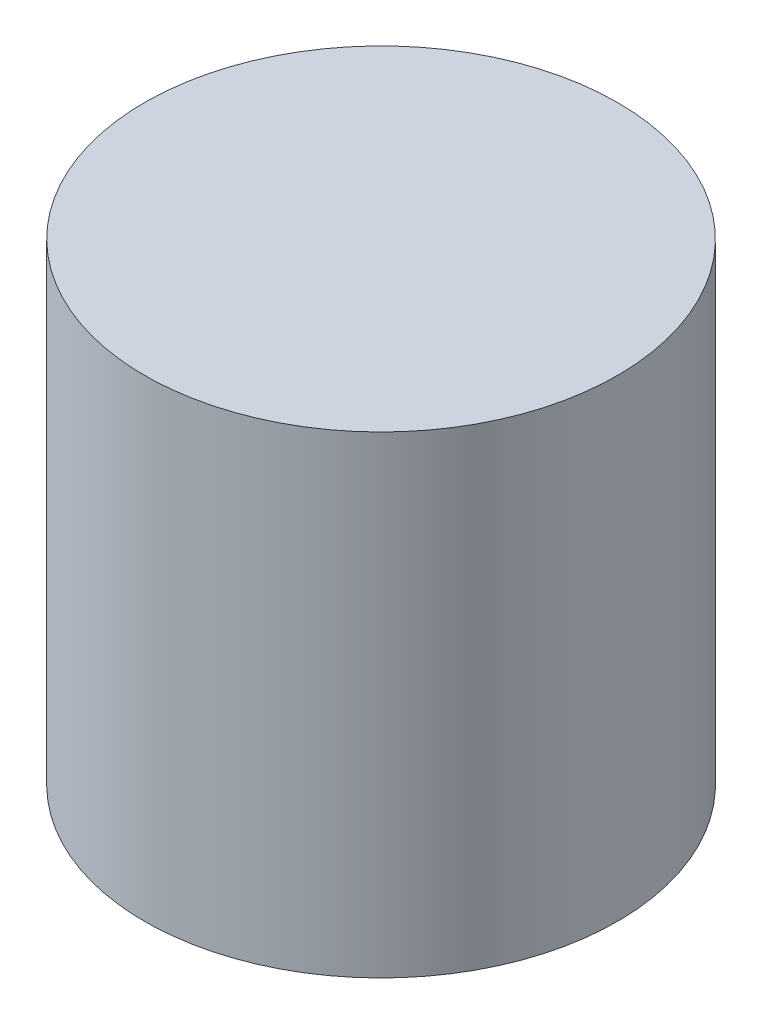
ISO-10303-21;
HEADER;
FILE_DESCRIPTION(('STEP AP214'),'2;1');
FILE_NAME('part.step','',(''),(''),'','','');
FILE_SCHEMA(('AUTOMOTIVE_DESIGN { 1 0 10303 214 1 1 1 1 }'));
ENDSEC;
DATA;
#1=APPLICATION_CONTEXT('core data for automotive mechanical design processes');
#2=APPLICATION_PROTOCOL_DEFINITION('international standard','automotive_design',2000,#1);
#3=PRODUCT_CONTEXT('',#1,'mechanical');
#4=PRODUCT('Part','Part','',(#3));
#5=PRODUCT_RELATED_PRODUCT_CATEGORY('part','',(#4));
#6=PRODUCT_DEFINITION_FORMATION('','',#4);
#7=PRODUCT_DEFINITION_CONTEXT('part definition',#1,'design');
#8=PRODUCT_DEFINITION('design','',#6,#7);
#9=PRODUCT_DEFINITION_SHAPE('','',#8);
#10=(LENGTH_UNIT() NAMED_UNIT(*) SI_UNIT(.MILLI.,.METRE.));
#11=(NAMED_UNIT(*) PLANE_ANGLE_UNIT() SI_UNIT($,.RADIAN.));
#12=(NAMED_UNIT(*) SI_UNIT($,.STERADIAN.) SOLID_ANGLE_UNIT());
#13=UNCERTAINTY_MEASURE_WITH_UNIT(LENGTH_MEASURE(1.E-05),#10,'distance_accuracy_value','');
#14=(GEOMETRIC_REPRESENTATION_CONTEXT(3) GLOBAL_UNCERTAINTY_ASSIGNED_CONTEXT((#13)) GLOBAL_UNIT_ASSIGNED_CONTEXT((#10,
#11,#12)) REPRESENTATION_CONTEXT('',''));
#15=CARTESIAN_POINT('',(0.,0.,0.));
#16=DIRECTION('',(0.,0.,1.));
#17=DIRECTION('',(1.,0.,0.));
#18=AXIS2_PLACEMENT_3D('',#15,#16,#17);
#19=CARTESIAN_POINT('',(0.,158.549048986486,5.41191311648753E-13));
#20=DIRECTION('',(0.,1.,0.));
#21=DIRECTION('',(0.,0.,1.));
#22=AXIS2_PLACEMENT_3D('',#19,#20,#21);
#23=PLANE('',#22);
#24=CARTESIAN_POINT('',(0.,158.549048986486,5.43862716560187E-13));
#25=DIRECTION('',(0.,-1.,0.));
#26=DIRECTION('',(0.,0.,-1.));
#27=AXIS2_PLACEMENT_3D('',#24,#25,#26);
#28=CIRCLE('',#27,50.);
#29=CARTESIAN_POINT('',(0.,158.549048986486,-49.9999999999995));
#30=VERTEX_POINT('',#29);
#31=EDGE_CURVE('E10',#30,#30,#28,.T.);
#32=ORIENTED_EDGE('',*,*,#31,.F.);
#33=EDGE_LOOP('',(#32));
#34=FACE_BOUND('',#33,.T.);
#35=ADVANCED_FACE('F37',(#34),#23,.T.);
#36=CARTESIAN_POINT('',(0.,-3564.01431948014,-1.22254565514113E-11));
#37=DIRECTION('',(0.,-1.,0.));
#38=DIRECTION('',(0.,0.,-1.));
#39=AXIS2_PLACEMENT_3D('',#36,#37,#38);
#40=CYLINDRICAL_SURFACE('',#39,50.0000000000003);
#41=ORIENTED_EDGE('',*,*,#31,.T.);
#42=EDGE_LOOP('',(#41));
#43=FACE_BOUND('',#42,.T.);
#44=CARTESIAN_POINT('',(0.,58.5490489864862,2.0083781667161E-13));
#45=DIRECTION('',(0.,-1.,0.));
#46=DIRECTION('',(0.,0.,-1.));
#47=AXIS2_PLACEMENT_3D('',#44,#45,#46);
#48=CIRCLE('',#47,50.0000000000002);
#49=CARTESIAN_POINT('',(0.,58.5490489864863,-50.));
#50=VERTEX_POINT('',#49);
#51=EDGE_CURVE('E44',#50,#50,#48,.T.);
#52=ORIENTED_EDGE('',*,*,#51,.F.);
#53=EDGE_LOOP('',(#52));
#54=FACE_BOUND('',#53,.T.);
#55=ADVANCED_FACE('F73',(#43,#54),#40,.T.);
#56=CARTESIAN_POINT('',(0.,58.549048986486,-50.));
#57=DIRECTION('',(0.,-1.,0.));
#58=DIRECTION('',(0.,0.,-1.));
#59=AXIS2_PLACEMENT_3D('',#56,#57,#58);
#60=PLANE('',#59);
#61=ORIENTED_EDGE('',*,*,#51,.T.);
#62=EDGE_LOOP('',(#61));
#63=FACE_BOUND('',#62,.T.);
#64=CARTESIAN_POINT('',(0.,58.5490489864862,2.0083781667161E-13));
#65=DIRECTION('',(0.,-1.,0.));
#66=DIRECTION('',(0.,0.,-1.));
#67=AXIS2_PLACEMENT_3D('',#64,#65,#66);
#68=CIRCLE('',#67,40.0000000000002);
#69=CARTESIAN_POINT('',(0.,58.5490489864863,-40.));
#70=VERTEX_POINT('',#69);
#71=EDGE_CURVE('E49',#70,#70,#68,.T.);
#72=ORIENTED_EDGE('',*,*,#71,.F.);
#73=EDGE_LOOP('',(#72));
#74=FACE_BOUND('',#73,.T.);
#75=ADVANCED_FACE('F65',(#63,#74),#60,.T.);
#76=CARTESIAN_POINT('',(0.,-3564.01431948014,-1.22254565514113E-11));
#77=DIRECTION('',(0.,-1.,0.));
#78=DIRECTION('',(0.,0.,-1.));
#79=AXIS2_PLACEMENT_3D('',#76,#77,#78);
#80=CYLINDRICAL_SURFACE('',#79,40.0000000000003);
#81=ORIENTED_EDGE('',*,*,#71,.T.);
#82=EDGE_LOOP('',(#81));
#83=FACE_BOUND('',#82,.T.);
#84=CARTESIAN_POINT('',(0.,138.549048986486,4.7525773658247E-13));
#85=DIRECTION('',(0.,-1.,0.));
#86=DIRECTION('',(0.,0.,-1.));
#87=AXIS2_PLACEMENT_3D('',#84,#85,#86);
#88=CIRCLE('',#87,40.0000000000005);
#89=CARTESIAN_POINT('',(0.,138.549048986486,-40.));
#90=VERTEX_POINT('',#89);
#91=EDGE_CURVE('E54',#90,#90,#88,.T.);
#92=ORIENTED_EDGE('',*,*,#91,.F.);
#93=EDGE_LOOP('',(#92));
#94=FACE_BOUND('',#93,.T.);
#95=ADVANCED_FACE('F63',(#83,#94),#80,.F.);
#96=CARTESIAN_POINT('',(0.,138.549048986486,-40.));
#97=DIRECTION('',(0.,-1.,0.));
#98=DIRECTION('',(0.,0.,-1.));
#99=AXIS2_PLACEMENT_3D('',#96,#97,#98);
#100=PLANE('',#99);
#101=ORIENTED_EDGE('',*,*,#91,.T.);
#102=EDGE_LOOP('',(#101));
#103=FACE_BOUND('',#102,.T.);
#104=ADVANCED_FACE('F61',(#103),#100,.T.);
#105=CLOSED_SHELL('',(#35,#55,#75,#95,#104));
#106=MANIFOLD_SOLID_BREP('B2',#105);
#107=ADVANCED_BREP_SHAPE_REPRESENTATION('',(#18,#106),#14);
#108=SHAPE_DEFINITION_REPRESENTATION(#9,#107);
ENDSEC;
END-ISO-10303-21;
